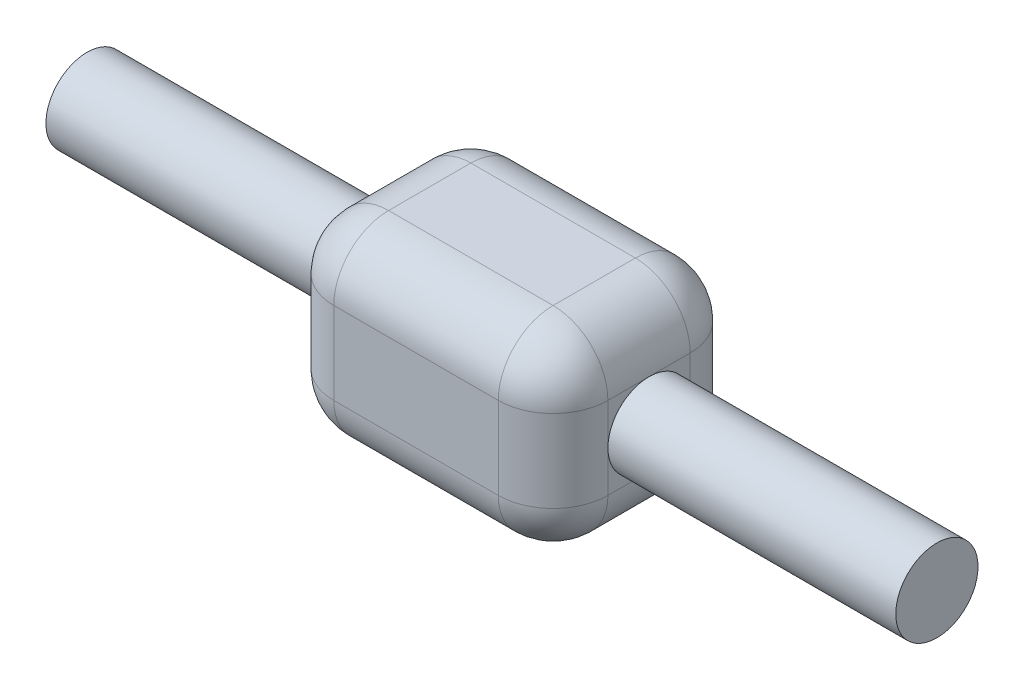
ISO-10303-21;
HEADER;
FILE_DESCRIPTION(('STEP AP214'),'2;1');
FILE_NAME('part.step','',(''),(''),'','','');
FILE_SCHEMA(('AUTOMOTIVE_DESIGN { 1 0 10303 214 1 1 1 1 }'));
ENDSEC;
DATA;
#1=APPLICATION_CONTEXT('core data for automotive mechanical design processes');
#2=APPLICATION_PROTOCOL_DEFINITION('international standard','automotive_design',2000,#1);
#3=PRODUCT_CONTEXT('',#1,'mechanical');
#4=PRODUCT('Part','Part','',(#3));
#5=PRODUCT_RELATED_PRODUCT_CATEGORY('part','',(#4));
#6=PRODUCT_DEFINITION_FORMATION('','',#4);
#7=PRODUCT_DEFINITION_CONTEXT('part definition',#1,'design');
#8=PRODUCT_DEFINITION('design','',#6,#7);
#9=PRODUCT_DEFINITION_SHAPE('','',#8);
#10=(LENGTH_UNIT() NAMED_UNIT(*) SI_UNIT(.MILLI.,.METRE.));
#11=(NAMED_UNIT(*) PLANE_ANGLE_UNIT() SI_UNIT($,.RADIAN.));
#12=(NAMED_UNIT(*) SI_UNIT($,.STERADIAN.) SOLID_ANGLE_UNIT());
#13=UNCERTAINTY_MEASURE_WITH_UNIT(LENGTH_MEASURE(1.E-05),#10,'distance_accuracy_value','');
#14=(GEOMETRIC_REPRESENTATION_CONTEXT(3) GLOBAL_UNCERTAINTY_ASSIGNED_CONTEXT((#13)) GLOBAL_UNIT_ASSIGNED_CONTEXT((#10,
#11,#12)) REPRESENTATION_CONTEXT('',''));
#15=CARTESIAN_POINT('',(0.,0.,0.));
#16=DIRECTION('',(0.,0.,1.));
#17=DIRECTION('',(1.,0.,0.));
#18=AXIS2_PLACEMENT_3D('',#15,#16,#17);
#19=CARTESIAN_POINT('',(25.,0.,0.));
#20=DIRECTION('',(1.,0.,0.));
#21=DIRECTION('',(0.,0.,-1.));
#22=AXIS2_PLACEMENT_3D('',#19,#20,#21);
#23=PLANE('',#22);
#24=DIRECTION('',(0.,-1.,0.));
#25=VECTOR('',#24,1.);
#26=CARTESIAN_POINT('',(25.,-7.5,7.5));
#27=LINE('',#26,#25);
#28=CARTESIAN_POINT('',(25.,0.,7.5));
#29=VERTEX_POINT('',#28);
#30=CARTESIAN_POINT('',(25.,-7.5,7.5));
#31=VERTEX_POINT('',#30);
#32=EDGE_CURVE('E59',#29,#31,#27,.T.);
#33=ORIENTED_EDGE('',*,*,#32,.T.);
#34=DIRECTION('',(0.,0.,-1.));
#35=VECTOR('',#34,1.);
#36=CARTESIAN_POINT('',(25.,-7.5,-7.50000000000001));
#37=LINE('',#36,#35);
#38=CARTESIAN_POINT('',(25.,-7.5,0.));
#39=VERTEX_POINT('',#38);
#40=EDGE_CURVE('E270',#31,#39,#37,.T.);
#41=ORIENTED_EDGE('',*,*,#40,.T.);
#42=CARTESIAN_POINT('',(25.,0.,0.));
#43=DIRECTION('',(1.,0.,0.));
#44=DIRECTION('',(0.,0.,-1.));
#45=AXIS2_PLACEMENT_3D('',#42,#43,#44);
#46=CIRCLE('',#45,7.5);
#47=EDGE_CURVE('E793',#29,#39,#46,.T.);
#48=ORIENTED_EDGE('',*,*,#47,.F.);
#49=EDGE_LOOP('',(#33,#41,#48));
#50=FACE_BOUND('',#49,.T.);
#51=ADVANCED_FACE('F41',(#50),#23,.T.);
#52=CARTESIAN_POINT('',(25.,0.,-7.50000000000001));
#53=VERTEX_POINT('',#52);
#54=EDGE_CURVE('E232',#39,#53,#46,.T.);
#55=ORIENTED_EDGE('',*,*,#54,.F.);
#56=DIRECTION('',(0.,0.,-1.));
#57=VECTOR('',#56,1.);
#58=CARTESIAN_POINT('',(25.,-7.5,-7.50000000000001));
#59=LINE('',#58,#57);
#60=CARTESIAN_POINT('',(25.,-7.5,-7.50000000000001));
#61=VERTEX_POINT('',#60);
#62=EDGE_CURVE('E67',#39,#61,#59,.T.);
#63=ORIENTED_EDGE('',*,*,#62,.T.);
#64=DIRECTION('',(0.,1.,0.));
#65=VECTOR('',#64,1.);
#66=CARTESIAN_POINT('',(25.,7.5,-7.50000000000001));
#67=LINE('',#66,#65);
#68=EDGE_CURVE('E280',#61,#53,#67,.T.);
#69=ORIENTED_EDGE('',*,*,#68,.T.);
#70=EDGE_LOOP('',(#55,#63,#69));
#71=FACE_BOUND('',#70,.T.);
#72=ADVANCED_FACE('F446',(#71),#23,.T.);
#73=CARTESIAN_POINT('',(25.,7.5,0.));
#74=VERTEX_POINT('',#73);
#75=EDGE_CURVE('E374',#53,#74,#46,.T.);
#76=ORIENTED_EDGE('',*,*,#75,.F.);
#77=DIRECTION('',(0.,1.,0.));
#78=VECTOR('',#77,1.);
#79=CARTESIAN_POINT('',(25.,7.5,-7.50000000000001));
#80=LINE('',#79,#78);
#81=CARTESIAN_POINT('',(25.,7.5,-7.50000000000001));
#82=VERTEX_POINT('',#81);
#83=EDGE_CURVE('E283',#53,#82,#80,.T.);
#84=ORIENTED_EDGE('',*,*,#83,.T.);
#85=DIRECTION('',(0.,0.,1.));
#86=VECTOR('',#85,1.);
#87=CARTESIAN_POINT('',(25.,7.5,7.5));
#88=LINE('',#87,#86);
#89=EDGE_CURVE('E289',#82,#74,#88,.T.);
#90=ORIENTED_EDGE('',*,*,#89,.T.);
#91=EDGE_LOOP('',(#76,#84,#90));
#92=FACE_BOUND('',#91,.T.);
#93=ADVANCED_FACE('F452',(#92),#23,.T.);
#94=CARTESIAN_POINT('',(-25.,0.,0.));
#95=DIRECTION('',(1.,0.,0.));
#96=DIRECTION('',(0.,0.,-1.));
#97=AXIS2_PLACEMENT_3D('',#94,#95,#96);
#98=PLANE('',#97);
#99=DIRECTION('',(0.,0.,1.));
#100=VECTOR('',#99,1.);
#101=CARTESIAN_POINT('',(-25.,7.5,0.));
#102=LINE('',#101,#100);
#103=CARTESIAN_POINT('',(-25.,7.5,0.));
#104=VERTEX_POINT('',#103);
#105=CARTESIAN_POINT('',(-25.,7.5,-7.50000000000001));
#106=VERTEX_POINT('',#105);
#107=EDGE_CURVE('E171',#104,#106,#102,.F.);
#108=ORIENTED_EDGE('',*,*,#107,.T.);
#109=DIRECTION('',(0.,1.,0.));
#110=VECTOR('',#109,1.);
#111=CARTESIAN_POINT('',(-25.,0.,-7.50000000000001));
#112=LINE('',#111,#110);
#113=CARTESIAN_POINT('',(-25.,0.,-7.50000000000001));
#114=VERTEX_POINT('',#113);
#115=EDGE_CURVE('E199',#106,#114,#112,.F.);
#116=ORIENTED_EDGE('',*,*,#115,.T.);
#117=CARTESIAN_POINT('',(-25.,0.,0.));
#118=DIRECTION('',(1.,0.,0.));
#119=DIRECTION('',(0.,0.,-1.));
#120=AXIS2_PLACEMENT_3D('',#117,#118,#119);
#121=CIRCLE('',#120,7.5);
#122=EDGE_CURVE('E185',#114,#104,#121,.T.);
#123=ORIENTED_EDGE('',*,*,#122,.T.);
#124=EDGE_LOOP('',(#108,#116,#123));
#125=FACE_BOUND('',#124,.T.);
#126=ADVANCED_FACE('F425',(#125),#98,.F.);
#127=CARTESIAN_POINT('',(-25.,-7.5,0.));
#128=VERTEX_POINT('',#127);
#129=EDGE_CURVE('E384',#128,#114,#121,.T.);
#130=ORIENTED_EDGE('',*,*,#129,.T.);
#131=DIRECTION('',(0.,1.,0.));
#132=VECTOR('',#131,1.);
#133=CARTESIAN_POINT('',(-25.,0.,-7.50000000000001));
#134=LINE('',#133,#132);
#135=CARTESIAN_POINT('',(-25.,-7.5,-7.50000000000001));
#136=VERTEX_POINT('',#135);
#137=EDGE_CURVE('E325',#114,#136,#134,.F.);
#138=ORIENTED_EDGE('',*,*,#137,.T.);
#139=DIRECTION('',(0.,0.,-1.));
#140=VECTOR('',#139,1.);
#141=CARTESIAN_POINT('',(-25.,-7.5,0.));
#142=LINE('',#141,#140);
#143=EDGE_CURVE('E328',#136,#128,#142,.F.);
#144=ORIENTED_EDGE('',*,*,#143,.T.);
#145=EDGE_LOOP('',(#130,#138,#144));
#146=FACE_BOUND('',#145,.T.);
#147=ADVANCED_FACE('F468',(#146),#98,.F.);
#148=CARTESIAN_POINT('',(-25.,0.,7.5));
#149=VERTEX_POINT('',#148);
#150=EDGE_CURVE('E395',#149,#128,#121,.T.);
#151=ORIENTED_EDGE('',*,*,#150,.T.);
#152=DIRECTION('',(0.,0.,-1.));
#153=VECTOR('',#152,1.);
#154=CARTESIAN_POINT('',(-25.,-7.5,0.));
#155=LINE('',#154,#153);
#156=CARTESIAN_POINT('',(-25.,-7.5,7.5));
#157=VERTEX_POINT('',#156);
#158=EDGE_CURVE('E331',#128,#157,#155,.F.);
#159=ORIENTED_EDGE('',*,*,#158,.T.);
#160=DIRECTION('',(0.,-1.,0.));
#161=VECTOR('',#160,1.);
#162=CARTESIAN_POINT('',(-25.,0.,7.5));
#163=LINE('',#162,#161);
#164=EDGE_CURVE('E334',#157,#149,#163,.F.);
#165=ORIENTED_EDGE('',*,*,#164,.T.);
#166=EDGE_LOOP('',(#151,#159,#165));
#167=FACE_BOUND('',#166,.T.);
#168=ADVANCED_FACE('F443',(#167),#98,.F.);
#169=CARTESIAN_POINT('',(77.5,0.,0.));
#170=DIRECTION('',(-1.,0.,0.));
#171=DIRECTION('',(0.,0.,1.));
#172=AXIS2_PLACEMENT_3D('',#169,#170,#171);
#173=CYLINDRICAL_SURFACE('',#172,7.5);
#174=ORIENTED_EDGE('',*,*,#75,.T.);
#175=EDGE_CURVE('E379',#74,#29,#46,.T.);
#176=ORIENTED_EDGE('',*,*,#175,.T.);
#177=ORIENTED_EDGE('',*,*,#47,.T.);
#178=ORIENTED_EDGE('',*,*,#54,.T.);
#179=EDGE_LOOP('',(#174,#176,#177,#178));
#180=FACE_BOUND('',#179,.T.);
#181=CARTESIAN_POINT('',(77.5,0.,0.));
#182=DIRECTION('',(1.,0.,0.));
#183=DIRECTION('',(0.,0.,-1.));
#184=AXIS2_PLACEMENT_3D('',#181,#182,#183);
#185=CIRCLE('',#184,7.5);
#186=CARTESIAN_POINT('',(77.5,0.,-7.5));
#187=VERTEX_POINT('',#186);
#188=EDGE_CURVE('E388',#187,#187,#185,.T.);
#189=ORIENTED_EDGE('',*,*,#188,.F.);
#190=EDGE_LOOP('',(#189));
#191=FACE_BOUND('',#190,.T.);
#192=ADVANCED_FACE('F432',(#180,#191),#173,.T.);
#193=CARTESIAN_POINT('',(77.5,0.,0.));
#194=DIRECTION('',(1.,0.,0.));
#195=DIRECTION('',(0.,0.,-1.));
#196=AXIS2_PLACEMENT_3D('',#193,#194,#195);
#197=PLANE('',#196);
#198=ORIENTED_EDGE('',*,*,#188,.T.);
#199=EDGE_LOOP('',(#198));
#200=FACE_BOUND('',#199,.T.);
#201=ADVANCED_FACE('F442',(#200),#197,.T.);
#202=CARTESIAN_POINT('',(25.,-17.5,17.5));
#203=DIRECTION('',(0.,0.,-1.));
#204=DIRECTION('',(-1.,0.,0.));
#205=AXIS2_PLACEMENT_3D('',#202,#203,#204);
#206=PLANE('',#205);
#207=DIRECTION('',(-1.,0.,0.));
#208=VECTOR('',#207,1.);
#209=CARTESIAN_POINT('',(25.,7.5,17.5));
#210=LINE('',#209,#208);
#211=CARTESIAN_POINT('',(15.,7.5,17.5));
#212=VERTEX_POINT('',#211);
#213=CARTESIAN_POINT('',(-15.,7.5,17.5));
#214=VERTEX_POINT('',#213);
#215=EDGE_CURVE('E353',#212,#214,#210,.T.);
#216=ORIENTED_EDGE('',*,*,#215,.T.);
#217=DIRECTION('',(0.,-1.,0.));
#218=VECTOR('',#217,1.);
#219=CARTESIAN_POINT('',(-15.,-17.5,17.5));
#220=LINE('',#219,#218);
#221=CARTESIAN_POINT('',(-15.,-7.5,17.5));
#222=VERTEX_POINT('',#221);
#223=EDGE_CURVE('E301',#214,#222,#220,.T.);
#224=ORIENTED_EDGE('',*,*,#223,.T.);
#225=DIRECTION('',(-1.,0.,0.));
#226=VECTOR('',#225,1.);
#227=CARTESIAN_POINT('',(25.,-7.5,17.5));
#228=LINE('',#227,#226);
#229=CARTESIAN_POINT('',(15.,-7.5,17.5));
#230=VERTEX_POINT('',#229);
#231=EDGE_CURVE('E349',#222,#230,#228,.F.);
#232=ORIENTED_EDGE('',*,*,#231,.T.);
#233=DIRECTION('',(0.,-1.,0.));
#234=VECTOR('',#233,1.);
#235=CARTESIAN_POINT('',(15.,7.5,17.5));
#236=LINE('',#235,#234);
#237=EDGE_CURVE('E263',#230,#212,#236,.F.);
#238=ORIENTED_EDGE('',*,*,#237,.T.);
#239=EDGE_LOOP('',(#216,#224,#232,#238));
#240=FACE_BOUND('',#239,.T.);
#241=ADVANCED_FACE('F529',(#240),#206,.F.);
#242=CARTESIAN_POINT('',(25.,-17.5,-17.5));
#243=DIRECTION('',(0.,1.,0.));
#244=DIRECTION('',(0.,0.,1.));
#245=AXIS2_PLACEMENT_3D('',#242,#243,#244);
#246=PLANE('',#245);
#247=DIRECTION('',(-1.,0.,0.));
#248=VECTOR('',#247,1.);
#249=CARTESIAN_POINT('',(25.,-17.5,7.5));
#250=LINE('',#249,#248);
#251=CARTESIAN_POINT('',(15.,-17.5,7.5));
#252=VERTEX_POINT('',#251);
#253=CARTESIAN_POINT('',(-15.,-17.5,7.5));
#254=VERTEX_POINT('',#253);
#255=EDGE_CURVE('E368',#252,#254,#250,.T.);
#256=ORIENTED_EDGE('',*,*,#255,.T.);
#257=DIRECTION('',(0.,0.,-1.));
#258=VECTOR('',#257,1.);
#259=CARTESIAN_POINT('',(-15.,-17.5,-17.5));
#260=LINE('',#259,#258);
#261=CARTESIAN_POINT('',(-15.,-17.5,-7.50000000000001));
#262=VERTEX_POINT('',#261);
#263=EDGE_CURVE('E311',#254,#262,#260,.T.);
#264=ORIENTED_EDGE('',*,*,#263,.T.);
#265=DIRECTION('',(-1.,0.,0.));
#266=VECTOR('',#265,1.);
#267=CARTESIAN_POINT('',(25.,-17.5,-7.50000000000001));
#268=LINE('',#267,#266);
#269=CARTESIAN_POINT('',(15.,-17.5,-7.50000000000001));
#270=VERTEX_POINT('',#269);
#271=EDGE_CURVE('E364',#262,#270,#268,.F.);
#272=ORIENTED_EDGE('',*,*,#271,.T.);
#273=DIRECTION('',(0.,0.,-1.));
#274=VECTOR('',#273,1.);
#275=CARTESIAN_POINT('',(15.,-17.5,7.5));
#276=LINE('',#275,#274);
#277=EDGE_CURVE('E314',#270,#252,#276,.F.);
#278=ORIENTED_EDGE('',*,*,#277,.T.);
#279=EDGE_LOOP('',(#256,#264,#272,#278));
#280=FACE_BOUND('',#279,.T.);
#281=ADVANCED_FACE('F504',(#280),#246,.F.);
#282=CARTESIAN_POINT('',(25.,-17.5,-17.5));
#283=DIRECTION('',(0.,0.,1.));
#284=DIRECTION('',(1.,0.,0.));
#285=AXIS2_PLACEMENT_3D('',#282,#283,#284);
#286=PLANE('',#285);
#287=DIRECTION('',(-1.,0.,0.));
#288=VECTOR('',#287,1.);
#289=CARTESIAN_POINT('',(25.,-7.5,-17.5));
#290=LINE('',#289,#288);
#291=CARTESIAN_POINT('',(15.,-7.5,-17.5));
#292=VERTEX_POINT('',#291);
#293=CARTESIAN_POINT('',(-15.,-7.5,-17.5));
#294=VERTEX_POINT('',#293);
#295=EDGE_CURVE('E165',#292,#294,#290,.T.);
#296=ORIENTED_EDGE('',*,*,#295,.T.);
#297=DIRECTION('',(0.,1.,0.));
#298=VECTOR('',#297,1.);
#299=CARTESIAN_POINT('',(-15.,-17.5,-17.5));
#300=LINE('',#299,#298);
#301=CARTESIAN_POINT('',(-15.,7.5,-17.5));
#302=VERTEX_POINT('',#301);
#303=EDGE_CURVE('E160',#294,#302,#300,.T.);
#304=ORIENTED_EDGE('',*,*,#303,.T.);
#305=DIRECTION('',(-1.,0.,0.));
#306=VECTOR('',#305,1.);
#307=CARTESIAN_POINT('',(25.,7.5,-17.5));
#308=LINE('',#307,#306);
#309=CARTESIAN_POINT('',(15.,7.5,-17.5));
#310=VERTEX_POINT('',#309);
#311=EDGE_CURVE('E163',#302,#310,#308,.F.);
#312=ORIENTED_EDGE('',*,*,#311,.T.);
#313=DIRECTION('',(0.,1.,0.));
#314=VECTOR('',#313,1.);
#315=CARTESIAN_POINT('',(15.,-7.5,-17.5));
#316=LINE('',#315,#314);
#317=EDGE_CURVE('E172',#310,#292,#316,.F.);
#318=ORIENTED_EDGE('',*,*,#317,.T.);
#319=EDGE_LOOP('',(#296,#304,#312,#318));
#320=FACE_BOUND('',#319,.T.);
#321=ADVANCED_FACE('F162',(#320),#286,.F.);
#322=CARTESIAN_POINT('',(25.,17.5,-17.5));
#323=DIRECTION('',(0.,-1.,0.));
#324=DIRECTION('',(0.,0.,-1.));
#325=AXIS2_PLACEMENT_3D('',#322,#323,#324);
#326=PLANE('',#325);
#327=DIRECTION('',(-1.,0.,0.));
#328=VECTOR('',#327,1.);
#329=CARTESIAN_POINT('',(25.,17.5,-7.5));
#330=LINE('',#329,#328);
#331=CARTESIAN_POINT('',(15.,17.5,-7.5));
#332=VERTEX_POINT('',#331);
#333=CARTESIAN_POINT('',(-15.,17.5,-7.5));
#334=VERTEX_POINT('',#333);
#335=EDGE_CURVE('E357',#332,#334,#330,.T.);
#336=ORIENTED_EDGE('',*,*,#335,.T.);
#337=DIRECTION('',(0.,0.,1.));
#338=VECTOR('',#337,1.);
#339=CARTESIAN_POINT('',(-15.,17.5,-17.5));
#340=LINE('',#339,#338);
#341=CARTESIAN_POINT('',(-15.,17.5,7.5));
#342=VERTEX_POINT('',#341);
#343=EDGE_CURVE('E11',#334,#342,#340,.T.);
#344=ORIENTED_EDGE('',*,*,#343,.T.);
#345=DIRECTION('',(-1.,0.,0.));
#346=VECTOR('',#345,1.);
#347=CARTESIAN_POINT('',(25.,17.5,7.5));
#348=LINE('',#347,#346);
#349=CARTESIAN_POINT('',(15.,17.5,7.5));
#350=VERTEX_POINT('',#349);
#351=EDGE_CURVE('E360',#342,#350,#348,.F.);
#352=ORIENTED_EDGE('',*,*,#351,.T.);
#353=DIRECTION('',(0.,0.,1.));
#354=VECTOR('',#353,1.);
#355=CARTESIAN_POINT('',(15.,17.5,-7.5));
#356=LINE('',#355,#354);
#357=EDGE_CURVE('E51',#350,#332,#356,.F.);
#358=ORIENTED_EDGE('',*,*,#357,.T.);
#359=EDGE_LOOP('',(#336,#344,#352,#358));
#360=FACE_BOUND('',#359,.T.);
#361=ADVANCED_FACE('F455',(#360),#326,.F.);
#362=DIRECTION('',(0.,0.,1.));
#363=VECTOR('',#362,1.);
#364=CARTESIAN_POINT('',(25.,7.5,7.5));
#365=LINE('',#364,#363);
#366=CARTESIAN_POINT('',(25.,7.5,7.5));
#367=VERTEX_POINT('',#366);
#368=EDGE_CURVE('E292',#74,#367,#365,.T.);
#369=ORIENTED_EDGE('',*,*,#368,.T.);
#370=DIRECTION('',(0.,-1.,0.));
#371=VECTOR('',#370,1.);
#372=CARTESIAN_POINT('',(25.,-7.5,7.5));
#373=LINE('',#372,#371);
#374=EDGE_CURVE('E286',#367,#29,#373,.T.);
#375=ORIENTED_EDGE('',*,*,#374,.T.);
#376=ORIENTED_EDGE('',*,*,#175,.F.);
#377=EDGE_LOOP('',(#369,#375,#376));
#378=FACE_BOUND('',#377,.T.);
#379=ADVANCED_FACE('F448',(#378),#23,.T.);
#380=EDGE_CURVE('E383',#104,#149,#121,.T.);
#381=ORIENTED_EDGE('',*,*,#380,.T.);
#382=DIRECTION('',(0.,-1.,0.));
#383=VECTOR('',#382,1.);
#384=CARTESIAN_POINT('',(-25.,0.,7.5));
#385=LINE('',#384,#383);
#386=CARTESIAN_POINT('',(-25.,7.5,7.5));
#387=VERTEX_POINT('',#386);
#388=EDGE_CURVE('E337',#149,#387,#385,.F.);
#389=ORIENTED_EDGE('',*,*,#388,.T.);
#390=DIRECTION('',(0.,0.,1.));
#391=VECTOR('',#390,1.);
#392=CARTESIAN_POINT('',(-25.,7.5,0.));
#393=LINE('',#392,#391);
#394=EDGE_CURVE('E340',#387,#104,#393,.F.);
#395=ORIENTED_EDGE('',*,*,#394,.T.);
#396=EDGE_LOOP('',(#381,#389,#395));
#397=FACE_BOUND('',#396,.T.);
#398=ADVANCED_FACE('F409',(#397),#98,.F.);
#399=CARTESIAN_POINT('',(-77.5,0.,0.));
#400=DIRECTION('',(1.,0.,0.));
#401=DIRECTION('',(0.,0.,-1.));
#402=AXIS2_PLACEMENT_3D('',#399,#400,#401);
#403=PLANE('',#402);
#404=CARTESIAN_POINT('',(-77.5,0.,0.));
#405=DIRECTION('',(1.,0.,0.));
#406=DIRECTION('',(0.,0.,-1.));
#407=AXIS2_PLACEMENT_3D('',#404,#405,#406);
#408=CIRCLE('',#407,7.5);
#409=CARTESIAN_POINT('',(-77.5,0.,-7.5));
#410=VERTEX_POINT('',#409);
#411=EDGE_CURVE('E378',#410,#410,#408,.T.);
#412=ORIENTED_EDGE('',*,*,#411,.F.);
#413=EDGE_LOOP('',(#412));
#414=FACE_BOUND('',#413,.T.);
#415=ADVANCED_FACE('F429',(#414),#403,.F.);
#416=ORIENTED_EDGE('',*,*,#411,.T.);
#417=EDGE_LOOP('',(#416));
#418=FACE_BOUND('',#417,.T.);
#419=ORIENTED_EDGE('',*,*,#122,.F.);
#420=ORIENTED_EDGE('',*,*,#129,.F.);
#421=ORIENTED_EDGE('',*,*,#150,.F.);
#422=ORIENTED_EDGE('',*,*,#380,.F.);
#423=EDGE_LOOP('',(#419,#420,#421,#422));
#424=FACE_BOUND('',#423,.T.);
#425=ADVANCED_FACE('F426',(#418,#424),#173,.T.);
#426=CARTESIAN_POINT('',(25.,-7.5,-7.50000000000001));
#427=DIRECTION('',(-1.,0.,0.));
#428=DIRECTION('',(0.,0.,1.));
#429=AXIS2_PLACEMENT_3D('',#426,#427,#428);
#430=CYLINDRICAL_SURFACE('',#429,10.);
#431=ORIENTED_EDGE('',*,*,#271,.F.);
#432=CARTESIAN_POINT('',(-15.,-7.5,-7.50000000000001));
#433=DIRECTION('',(-1.,0.,0.));
#434=DIRECTION('',(0.,0.,1.));
#435=AXIS2_PLACEMENT_3D('',#432,#433,#434);
#436=CIRCLE('',#435,10.);
#437=EDGE_CURVE('E317',#262,#294,#436,.F.);
#438=ORIENTED_EDGE('',*,*,#437,.T.);
#439=ORIENTED_EDGE('',*,*,#295,.F.);
#440=CARTESIAN_POINT('',(15.,-7.5,-7.50000000000001));
#441=DIRECTION('',(-1.,0.,0.));
#442=DIRECTION('',(0.,0.,1.));
#443=AXIS2_PLACEMENT_3D('',#440,#441,#442);
#444=CIRCLE('',#443,10.);
#445=EDGE_CURVE('E320',#292,#270,#444,.T.);
#446=ORIENTED_EDGE('',*,*,#445,.T.);
#447=EDGE_LOOP('',(#431,#438,#439,#446));
#448=FACE_BOUND('',#447,.T.);
#449=ADVANCED_FACE('F428',(#448),#430,.T.);
#450=CARTESIAN_POINT('',(25.,7.5,-7.50000000000001));
#451=DIRECTION('',(-1.,0.,0.));
#452=DIRECTION('',(0.,0.,1.));
#453=AXIS2_PLACEMENT_3D('',#450,#451,#452);
#454=CYLINDRICAL_SURFACE('',#453,10.);
#455=ORIENTED_EDGE('',*,*,#311,.F.);
#456=CARTESIAN_POINT('',(-15.,7.5,-7.50000000000001));
#457=DIRECTION('',(-1.,0.,0.));
#458=DIRECTION('',(0.,0.,1.));
#459=AXIS2_PLACEMENT_3D('',#456,#457,#458);
#460=CIRCLE('',#459,10.);
#461=EDGE_CURVE('E180',#302,#334,#460,.F.);
#462=ORIENTED_EDGE('',*,*,#461,.T.);
#463=ORIENTED_EDGE('',*,*,#335,.F.);
#464=CARTESIAN_POINT('',(15.,7.5,-7.50000000000001));
#465=DIRECTION('',(-1.,0.,0.));
#466=DIRECTION('',(0.,0.,1.));
#467=AXIS2_PLACEMENT_3D('',#464,#465,#466);
#468=CIRCLE('',#467,10.);
#469=EDGE_CURVE('E183',#332,#310,#468,.T.);
#470=ORIENTED_EDGE('',*,*,#469,.T.);
#471=EDGE_LOOP('',(#455,#462,#463,#470));
#472=FACE_BOUND('',#471,.T.);
#473=ADVANCED_FACE('F178',(#472),#454,.T.);
#474=CARTESIAN_POINT('',(25.,-7.5,7.5));
#475=DIRECTION('',(-1.,0.,0.));
#476=DIRECTION('',(0.,0.,1.));
#477=AXIS2_PLACEMENT_3D('',#474,#475,#476);
#478=CYLINDRICAL_SURFACE('',#477,10.);
#479=ORIENTED_EDGE('',*,*,#231,.F.);
#480=CARTESIAN_POINT('',(-15.,-7.5,7.5));
#481=DIRECTION('',(-1.,0.,0.));
#482=DIRECTION('',(0.,0.,1.));
#483=AXIS2_PLACEMENT_3D('',#480,#481,#482);
#484=CIRCLE('',#483,10.);
#485=EDGE_CURVE('E306',#222,#254,#484,.F.);
#486=ORIENTED_EDGE('',*,*,#485,.T.);
#487=ORIENTED_EDGE('',*,*,#255,.F.);
#488=CARTESIAN_POINT('',(15.,-7.5,7.5));
#489=DIRECTION('',(-1.,0.,0.));
#490=DIRECTION('',(0.,0.,1.));
#491=AXIS2_PLACEMENT_3D('',#488,#489,#490);
#492=CIRCLE('',#491,10.);
#493=EDGE_CURVE('E267',#252,#230,#492,.T.);
#494=ORIENTED_EDGE('',*,*,#493,.T.);
#495=EDGE_LOOP('',(#479,#486,#487,#494));
#496=FACE_BOUND('',#495,.T.);
#497=ADVANCED_FACE('F508',(#496),#478,.T.);
#498=CARTESIAN_POINT('',(25.,7.5,7.5));
#499=DIRECTION('',(-1.,0.,0.));
#500=DIRECTION('',(0.,0.,1.));
#501=AXIS2_PLACEMENT_3D('',#498,#499,#500);
#502=CYLINDRICAL_SURFACE('',#501,10.);
#503=ORIENTED_EDGE('',*,*,#351,.F.);
#504=CARTESIAN_POINT('',(-15.,7.5,7.5));
#505=DIRECTION('',(-1.,0.,0.));
#506=DIRECTION('',(0.,0.,1.));
#507=AXIS2_PLACEMENT_3D('',#504,#505,#506);
#508=CIRCLE('',#507,10.);
#509=EDGE_CURVE('E295',#342,#214,#508,.F.);
#510=ORIENTED_EDGE('',*,*,#509,.T.);
#511=ORIENTED_EDGE('',*,*,#215,.F.);
#512=CARTESIAN_POINT('',(15.,7.5,7.5));
#513=DIRECTION('',(-1.,0.,0.));
#514=DIRECTION('',(0.,0.,1.));
#515=AXIS2_PLACEMENT_3D('',#512,#513,#514);
#516=CIRCLE('',#515,10.);
#517=EDGE_CURVE('E298',#212,#350,#516,.T.);
#518=ORIENTED_EDGE('',*,*,#517,.T.);
#519=EDGE_LOOP('',(#503,#510,#511,#518));
#520=FACE_BOUND('',#519,.T.);
#521=ADVANCED_FACE('F489',(#520),#502,.T.);
#522=CARTESIAN_POINT('',(-15.,-7.5,7.5));
#523=DIRECTION('',(1.,0.,0.));
#524=DIRECTION('',(0.,0.,-1.));
#525=AXIS2_PLACEMENT_3D('',#522,#523,#524);
#526=SPHERICAL_SURFACE('',#525,10.);
#527=CARTESIAN_POINT('',(-15.,-7.5,7.5));
#528=DIRECTION('',(0.,0.,-1.));
#529=DIRECTION('',(-1.,0.,0.));
#530=AXIS2_PLACEMENT_3D('',#527,#528,#529);
#531=CIRCLE('',#530,10.);
#532=EDGE_CURVE('E224',#254,#157,#531,.T.);
#533=ORIENTED_EDGE('',*,*,#532,.F.);
#534=ORIENTED_EDGE('',*,*,#485,.F.);
#535=CARTESIAN_POINT('',(-15.,-7.5,7.5));
#536=DIRECTION('',(0.,1.,0.));
#537=DIRECTION('',(0.,0.,1.));
#538=AXIS2_PLACEMENT_3D('',#535,#536,#537);
#539=CIRCLE('',#538,10.);
#540=EDGE_CURVE('E228',#157,#222,#539,.T.);
#541=ORIENTED_EDGE('',*,*,#540,.F.);
#542=EDGE_LOOP('',(#533,#534,#541));
#543=FACE_BOUND('',#542,.T.);
#544=ADVANCED_FACE('F512',(#543),#526,.T.);
#545=CARTESIAN_POINT('',(-15.,-17.5,7.5));
#546=DIRECTION('',(0.,-1.,0.));
#547=DIRECTION('',(0.,0.,-1.));
#548=AXIS2_PLACEMENT_3D('',#545,#546,#547);
#549=CYLINDRICAL_SURFACE('',#548,10.);
#550=ORIENTED_EDGE('',*,*,#540,.T.);
#551=ORIENTED_EDGE('',*,*,#223,.F.);
#552=CARTESIAN_POINT('',(-15.,7.5,7.5));
#553=DIRECTION('',(0.,1.,0.));
#554=DIRECTION('',(0.,0.,1.));
#555=AXIS2_PLACEMENT_3D('',#552,#553,#554);
#556=CIRCLE('',#555,10.);
#557=EDGE_CURVE('E220',#387,#214,#556,.T.);
#558=ORIENTED_EDGE('',*,*,#557,.F.);
#559=ORIENTED_EDGE('',*,*,#388,.F.);
#560=ORIENTED_EDGE('',*,*,#164,.F.);
#561=EDGE_LOOP('',(#550,#551,#558,#559,#560));
#562=FACE_BOUND('',#561,.T.);
#563=ADVANCED_FACE('F415',(#562),#549,.T.);
#564=CARTESIAN_POINT('',(-15.,-7.5,-17.5));
#565=DIRECTION('',(0.,0.,-1.));
#566=DIRECTION('',(0.,1.,0.));
#567=AXIS2_PLACEMENT_3D('',#564,#565,#566);
#568=CYLINDRICAL_SURFACE('',#567,10.);
#569=ORIENTED_EDGE('',*,*,#158,.F.);
#570=ORIENTED_EDGE('',*,*,#143,.F.);
#571=CARTESIAN_POINT('',(-15.,-7.5,-7.50000000000001));
#572=DIRECTION('',(0.,0.,-1.));
#573=DIRECTION('',(-1.,0.,0.));
#574=AXIS2_PLACEMENT_3D('',#571,#572,#573);
#575=CIRCLE('',#574,10.);
#576=EDGE_CURVE('E216',#262,#136,#575,.T.);
#577=ORIENTED_EDGE('',*,*,#576,.F.);
#578=ORIENTED_EDGE('',*,*,#263,.F.);
#579=ORIENTED_EDGE('',*,*,#532,.T.);
#580=EDGE_LOOP('',(#569,#570,#577,#578,#579));
#581=FACE_BOUND('',#580,.T.);
#582=ADVANCED_FACE('F516',(#581),#568,.T.);
#583=CARTESIAN_POINT('',(-15.,7.5,7.5));
#584=DIRECTION('',(1.,0.,0.));
#585=DIRECTION('',(0.,0.,-1.));
#586=AXIS2_PLACEMENT_3D('',#583,#584,#585);
#587=SPHERICAL_SURFACE('',#586,10.);
#588=ORIENTED_EDGE('',*,*,#557,.T.);
#589=ORIENTED_EDGE('',*,*,#509,.F.);
#590=CARTESIAN_POINT('',(-15.,7.5,7.5));
#591=DIRECTION('',(0.,0.,-1.));
#592=DIRECTION('',(0.,1.,0.));
#593=AXIS2_PLACEMENT_3D('',#590,#591,#592);
#594=CIRCLE('',#593,10.);
#595=EDGE_CURVE('E212',#387,#342,#594,.T.);
#596=ORIENTED_EDGE('',*,*,#595,.F.);
#597=EDGE_LOOP('',(#588,#589,#596));
#598=FACE_BOUND('',#597,.T.);
#599=ADVANCED_FACE('F420',(#598),#587,.T.);
#600=CARTESIAN_POINT('',(-15.,-7.5,-7.50000000000001));
#601=DIRECTION('',(1.,0.,0.));
#602=DIRECTION('',(0.,0.,-1.));
#603=AXIS2_PLACEMENT_3D('',#600,#601,#602);
#604=SPHERICAL_SURFACE('',#603,10.);
#605=ORIENTED_EDGE('',*,*,#437,.F.);
#606=ORIENTED_EDGE('',*,*,#576,.T.);
#607=CARTESIAN_POINT('',(-15.,-7.5,-7.50000000000001));
#608=DIRECTION('',(0.,1.,0.));
#609=DIRECTION('',(0.,0.,1.));
#610=AXIS2_PLACEMENT_3D('',#607,#608,#609);
#611=CIRCLE('',#610,10.);
#612=EDGE_CURVE('E204',#294,#136,#611,.T.);
#613=ORIENTED_EDGE('',*,*,#612,.F.);
#614=EDGE_LOOP('',(#605,#606,#613));
#615=FACE_BOUND('',#614,.T.);
#616=ADVANCED_FACE('F519',(#615),#604,.T.);
#617=CARTESIAN_POINT('',(-15.,7.50000000000001,-17.5));
#618=DIRECTION('',(0.,0.,1.));
#619=DIRECTION('',(0.,-1.,0.));
#620=AXIS2_PLACEMENT_3D('',#617,#618,#619);
#621=CYLINDRICAL_SURFACE('',#620,10.);
#622=ORIENTED_EDGE('',*,*,#595,.T.);
#623=ORIENTED_EDGE('',*,*,#343,.F.);
#624=CARTESIAN_POINT('',(-15.,7.5,-7.50000000000001));
#625=DIRECTION('',(0.,0.,-1.));
#626=DIRECTION('',(0.,1.,0.));
#627=AXIS2_PLACEMENT_3D('',#624,#625,#626);
#628=CIRCLE('',#627,10.);
#629=EDGE_CURVE('E192',#106,#334,#628,.T.);
#630=ORIENTED_EDGE('',*,*,#629,.F.);
#631=ORIENTED_EDGE('',*,*,#107,.F.);
#632=ORIENTED_EDGE('',*,*,#394,.F.);
#633=EDGE_LOOP('',(#622,#623,#630,#631,#632));
#634=FACE_BOUND('',#633,.T.);
#635=ADVANCED_FACE('F423',(#634),#621,.T.);
#636=CARTESIAN_POINT('',(-15.,-17.5,-7.50000000000001));
#637=DIRECTION('',(0.,1.,0.));
#638=DIRECTION('',(0.,0.,1.));
#639=AXIS2_PLACEMENT_3D('',#636,#637,#638);
#640=CYLINDRICAL_SURFACE('',#639,10.);
#641=ORIENTED_EDGE('',*,*,#137,.F.);
#642=ORIENTED_EDGE('',*,*,#115,.F.);
#643=CARTESIAN_POINT('',(-15.,7.5,-7.50000000000001));
#644=DIRECTION('',(0.,1.,0.));
#645=DIRECTION('',(-1.,0.,0.));
#646=AXIS2_PLACEMENT_3D('',#643,#644,#645);
#647=CIRCLE('',#646,10.);
#648=EDGE_CURVE('E190',#302,#106,#647,.T.);
#649=ORIENTED_EDGE('',*,*,#648,.F.);
#650=ORIENTED_EDGE('',*,*,#303,.F.);
#651=ORIENTED_EDGE('',*,*,#612,.T.);
#652=EDGE_LOOP('',(#641,#642,#649,#650,#651));
#653=FACE_BOUND('',#652,.T.);
#654=ADVANCED_FACE('F197',(#653),#640,.T.);
#655=CARTESIAN_POINT('',(-15.,7.5,-7.50000000000001));
#656=DIRECTION('',(1.,0.,0.));
#657=DIRECTION('',(0.,0.,-1.));
#658=AXIS2_PLACEMENT_3D('',#655,#656,#657);
#659=SPHERICAL_SURFACE('',#658,10.);
#660=ORIENTED_EDGE('',*,*,#629,.T.);
#661=ORIENTED_EDGE('',*,*,#461,.F.);
#662=ORIENTED_EDGE('',*,*,#648,.T.);
#663=EDGE_LOOP('',(#660,#661,#662));
#664=FACE_BOUND('',#663,.T.);
#665=ADVANCED_FACE('F189',(#664),#659,.T.);
#666=CARTESIAN_POINT('',(15.,-7.5,7.5));
#667=DIRECTION('',(1.,0.,0.));
#668=DIRECTION('',(0.,0.,-1.));
#669=AXIS2_PLACEMENT_3D('',#666,#667,#668);
#670=SPHERICAL_SURFACE('',#669,10.);
#671=CARTESIAN_POINT('',(15.,-7.5,7.5));
#672=DIRECTION('',(0.,1.,0.));
#673=DIRECTION('',(0.,0.,1.));
#674=AXIS2_PLACEMENT_3D('',#671,#672,#673);
#675=CIRCLE('',#674,10.);
#676=EDGE_CURVE('E207',#230,#31,#675,.T.);
#677=ORIENTED_EDGE('',*,*,#676,.F.);
#678=ORIENTED_EDGE('',*,*,#493,.F.);
#679=CARTESIAN_POINT('',(15.,-7.5,7.5));
#680=DIRECTION('',(0.,0.,-1.));
#681=DIRECTION('',(-1.,0.,0.));
#682=AXIS2_PLACEMENT_3D('',#679,#680,#681);
#683=CIRCLE('',#682,10.);
#684=EDGE_CURVE('E45',#31,#252,#683,.T.);
#685=ORIENTED_EDGE('',*,*,#684,.F.);
#686=EDGE_LOOP('',(#677,#678,#685));
#687=FACE_BOUND('',#686,.T.);
#688=ADVANCED_FACE('F43',(#687),#670,.T.);
#689=CARTESIAN_POINT('',(15.,-7.5,0.));
#690=DIRECTION('',(0.,0.,1.));
#691=DIRECTION('',(0.,-1.,0.));
#692=AXIS2_PLACEMENT_3D('',#689,#690,#691);
#693=CYLINDRICAL_SURFACE('',#692,10.);
#694=ORIENTED_EDGE('',*,*,#684,.T.);
#695=ORIENTED_EDGE('',*,*,#277,.F.);
#696=CARTESIAN_POINT('',(15.,-7.5,-7.50000000000001));
#697=DIRECTION('',(0.,0.,-1.));
#698=DIRECTION('',(0.,1.,0.));
#699=AXIS2_PLACEMENT_3D('',#696,#697,#698);
#700=CIRCLE('',#699,10.);
#701=EDGE_CURVE('E252',#61,#270,#700,.T.);
#702=ORIENTED_EDGE('',*,*,#701,.F.);
#703=ORIENTED_EDGE('',*,*,#62,.F.);
#704=ORIENTED_EDGE('',*,*,#40,.F.);
#705=EDGE_LOOP('',(#694,#695,#702,#703,#704));
#706=FACE_BOUND('',#705,.T.);
#707=ADVANCED_FACE('F271',(#706),#693,.T.);
#708=CARTESIAN_POINT('',(15.,0.,7.5));
#709=DIRECTION('',(0.,1.,0.));
#710=DIRECTION('',(0.,0.,1.));
#711=AXIS2_PLACEMENT_3D('',#708,#709,#710);
#712=CYLINDRICAL_SURFACE('',#711,10.);
#713=ORIENTED_EDGE('',*,*,#32,.F.);
#714=ORIENTED_EDGE('',*,*,#374,.F.);
#715=CARTESIAN_POINT('',(15.,7.5,7.5));
#716=DIRECTION('',(0.,1.,0.));
#717=DIRECTION('',(0.,0.,1.));
#718=AXIS2_PLACEMENT_3D('',#715,#716,#717);
#719=CIRCLE('',#718,10.);
#720=EDGE_CURVE('E248',#212,#367,#719,.T.);
#721=ORIENTED_EDGE('',*,*,#720,.F.);
#722=ORIENTED_EDGE('',*,*,#237,.F.);
#723=ORIENTED_EDGE('',*,*,#676,.T.);
#724=EDGE_LOOP('',(#713,#714,#721,#722,#723));
#725=FACE_BOUND('',#724,.T.);
#726=ADVANCED_FACE('F260',(#725),#712,.T.);
#727=CARTESIAN_POINT('',(15.,-7.5,-7.50000000000001));
#728=DIRECTION('',(1.,0.,0.));
#729=DIRECTION('',(0.,0.,-1.));
#730=AXIS2_PLACEMENT_3D('',#727,#728,#729);
#731=SPHERICAL_SURFACE('',#730,10.);
#732=ORIENTED_EDGE('',*,*,#701,.T.);
#733=ORIENTED_EDGE('',*,*,#445,.F.);
#734=CARTESIAN_POINT('',(15.,-7.5,-7.50000000000001));
#735=DIRECTION('',(0.,1.,0.));
#736=DIRECTION('',(0.,0.,1.));
#737=AXIS2_PLACEMENT_3D('',#734,#735,#736);
#738=CIRCLE('',#737,10.);
#739=EDGE_CURVE('E244',#61,#292,#738,.T.);
#740=ORIENTED_EDGE('',*,*,#739,.F.);
#741=EDGE_LOOP('',(#732,#733,#740));
#742=FACE_BOUND('',#741,.T.);
#743=ADVANCED_FACE('F501',(#742),#731,.T.);
#744=CARTESIAN_POINT('',(15.,7.5,7.5));
#745=DIRECTION('',(1.,0.,0.));
#746=DIRECTION('',(0.,0.,-1.));
#747=AXIS2_PLACEMENT_3D('',#744,#745,#746);
#748=SPHERICAL_SURFACE('',#747,10.);
#749=ORIENTED_EDGE('',*,*,#517,.F.);
#750=ORIENTED_EDGE('',*,*,#720,.T.);
#751=CARTESIAN_POINT('',(15.,7.5,7.5));
#752=DIRECTION('',(0.,0.,-1.));
#753=DIRECTION('',(0.,1.,0.));
#754=AXIS2_PLACEMENT_3D('',#751,#752,#753);
#755=CIRCLE('',#754,10.);
#756=EDGE_CURVE('E240',#350,#367,#755,.T.);
#757=ORIENTED_EDGE('',*,*,#756,.F.);
#758=EDGE_LOOP('',(#749,#750,#757));
#759=FACE_BOUND('',#758,.T.);
#760=ADVANCED_FACE('F485',(#759),#748,.T.);
#761=CARTESIAN_POINT('',(15.,0.,-7.50000000000001));
#762=DIRECTION('',(0.,-1.,0.));
#763=DIRECTION('',(0.,0.,-1.));
#764=AXIS2_PLACEMENT_3D('',#761,#762,#763);
#765=CYLINDRICAL_SURFACE('',#764,10.);
#766=ORIENTED_EDGE('',*,*,#739,.T.);
#767=ORIENTED_EDGE('',*,*,#317,.F.);
#768=CARTESIAN_POINT('',(15.,7.5,-7.50000000000001));
#769=DIRECTION('',(0.,1.,0.));
#770=DIRECTION('',(0.,0.,1.));
#771=AXIS2_PLACEMENT_3D('',#768,#769,#770);
#772=CIRCLE('',#771,10.);
#773=EDGE_CURVE('E237',#82,#310,#772,.T.);
#774=ORIENTED_EDGE('',*,*,#773,.F.);
#775=ORIENTED_EDGE('',*,*,#83,.F.);
#776=ORIENTED_EDGE('',*,*,#68,.F.);
#777=EDGE_LOOP('',(#766,#767,#774,#775,#776));
#778=FACE_BOUND('',#777,.T.);
#779=ADVANCED_FACE('F494',(#778),#765,.T.);
#780=CARTESIAN_POINT('',(15.,7.5,0.));
#781=DIRECTION('',(0.,0.,-1.));
#782=DIRECTION('',(0.,1.,0.));
#783=AXIS2_PLACEMENT_3D('',#780,#781,#782);
#784=CYLINDRICAL_SURFACE('',#783,10.);
#785=ORIENTED_EDGE('',*,*,#368,.F.);
#786=ORIENTED_EDGE('',*,*,#89,.F.);
#787=CARTESIAN_POINT('',(15.,7.50000000000001,-7.5));
#788=DIRECTION('',(0.,0.,-1.));
#789=DIRECTION('',(0.,1.,0.));
#790=AXIS2_PLACEMENT_3D('',#787,#788,#789);
#791=CIRCLE('',#790,10.);
#792=EDGE_CURVE('E233',#332,#82,#791,.T.);
#793=ORIENTED_EDGE('',*,*,#792,.F.);
#794=ORIENTED_EDGE('',*,*,#357,.F.);
#795=ORIENTED_EDGE('',*,*,#756,.T.);
#796=EDGE_LOOP('',(#785,#786,#793,#794,#795));
#797=FACE_BOUND('',#796,.T.);
#798=ADVANCED_FACE('F478',(#797),#784,.T.);
#799=CARTESIAN_POINT('',(15.,7.5,-7.50000000000001));
#800=DIRECTION('',(1.,0.,0.));
#801=DIRECTION('',(0.,0.,-1.));
#802=AXIS2_PLACEMENT_3D('',#799,#800,#801);
#803=SPHERICAL_SURFACE('',#802,10.);
#804=ORIENTED_EDGE('',*,*,#773,.T.);
#805=ORIENTED_EDGE('',*,*,#469,.F.);
#806=ORIENTED_EDGE('',*,*,#792,.T.);
#807=EDGE_LOOP('',(#804,#805,#806));
#808=FACE_BOUND('',#807,.T.);
#809=ADVANCED_FACE('F491',(#808),#803,.T.);
#810=CLOSED_SHELL('',(#51,#72,#93,#126,#147,#168,#192,#201,#241,#281,#321,#361,#379,#398,#415,
#425,#449,#473,#497,#521,#544,#563,#582,#599,#616,#635,#654,#665,#688,#707,#726,#743,#760,#779,
#798,#809));
#811=MANIFOLD_SOLID_BREP('B2',#810);
#812=ADVANCED_BREP_SHAPE_REPRESENTATION('',(#18,#811),#14);
#813=SHAPE_DEFINITION_REPRESENTATION(#9,#812);
ENDSEC;
END-ISO-10303-21;
